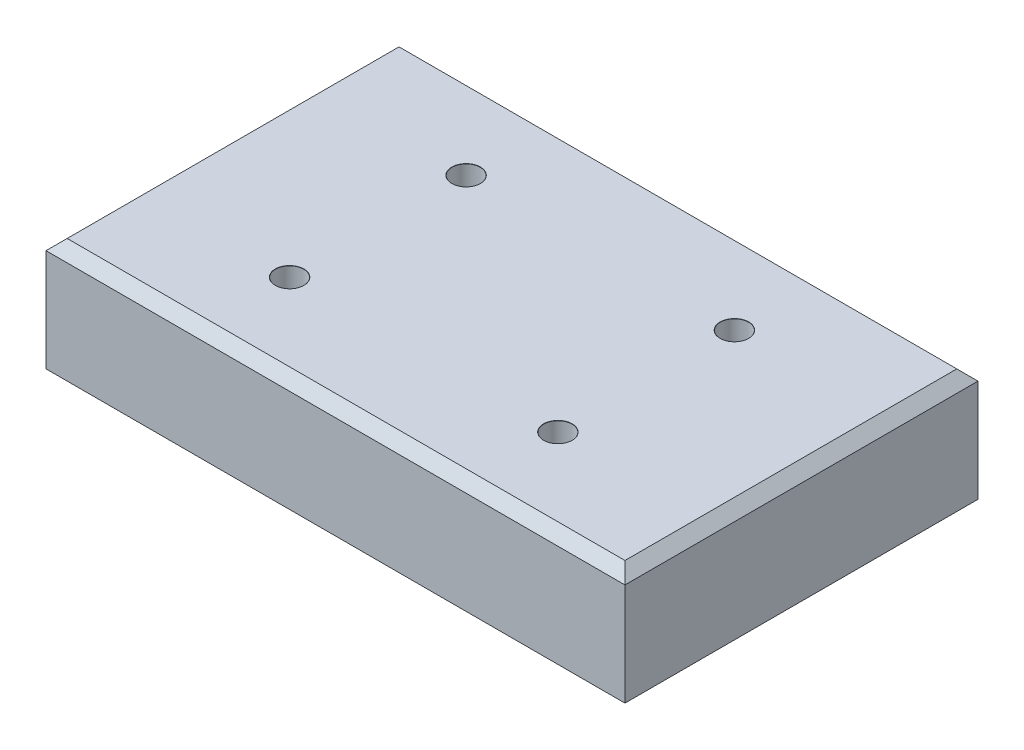
ISO-10303-21;
HEADER;
FILE_DESCRIPTION(('STEP AP214'),'2;1');
FILE_NAME('part.step','',(''),(''),'','','');
FILE_SCHEMA(('AUTOMOTIVE_DESIGN { 1 0 10303 214 1 1 1 1 }'));
ENDSEC;
DATA;
#1=APPLICATION_CONTEXT('core data for automotive mechanical design processes');
#2=APPLICATION_PROTOCOL_DEFINITION('international standard','automotive_design',2000,#1);
#3=PRODUCT_CONTEXT('',#1,'mechanical');
#4=PRODUCT('Part','Part','',(#3));
#5=PRODUCT_RELATED_PRODUCT_CATEGORY('part','',(#4));
#6=PRODUCT_DEFINITION_FORMATION('','',#4);
#7=PRODUCT_DEFINITION_CONTEXT('part definition',#1,'design');
#8=PRODUCT_DEFINITION('design','',#6,#7);
#9=PRODUCT_DEFINITION_SHAPE('','',#8);
#10=(LENGTH_UNIT() NAMED_UNIT(*) SI_UNIT(.MILLI.,.METRE.));
#11=(NAMED_UNIT(*) PLANE_ANGLE_UNIT() SI_UNIT($,.RADIAN.));
#12=(NAMED_UNIT(*) SI_UNIT($,.STERADIAN.) SOLID_ANGLE_UNIT());
#13=UNCERTAINTY_MEASURE_WITH_UNIT(LENGTH_MEASURE(1.E-05),#10,'distance_accuracy_value','');
#14=(GEOMETRIC_REPRESENTATION_CONTEXT(3) GLOBAL_UNCERTAINTY_ASSIGNED_CONTEXT((#13)) GLOBAL_UNIT_ASSIGNED_CONTEXT((#10,
#11,#12)) REPRESENTATION_CONTEXT('',''));
#15=CARTESIAN_POINT('',(0.,0.,0.));
#16=DIRECTION('',(0.,0.,1.));
#17=DIRECTION('',(1.,0.,0.));
#18=AXIS2_PLACEMENT_3D('',#15,#16,#17);
#19=CARTESIAN_POINT('',(-41.,16.,0.));
#20=DIRECTION('',(-1.,0.,0.));
#21=DIRECTION('',(0.,0.,1.));
#22=AXIS2_PLACEMENT_3D('',#19,#20,#21);
#23=PLANE('',#22);
#24=DIRECTION('',(0.,-1.,0.));
#25=VECTOR('',#24,1.);
#26=CARTESIAN_POINT('',(-41.,16.,25.));
#27=LINE('',#26,#25);
#28=CARTESIAN_POINT('',(-41.,14.5,25.));
#29=VERTEX_POINT('',#28);
#30=CARTESIAN_POINT('',(-41.,0.,25.));
#31=VERTEX_POINT('',#30);
#32=EDGE_CURVE('E217',#29,#31,#27,.T.);
#33=ORIENTED_EDGE('',*,*,#32,.F.);
#34=DIRECTION('',(0.,0.,-1.));
#35=VECTOR('',#34,1.);
#36=CARTESIAN_POINT('',(-41.,14.5,0.));
#37=LINE('',#36,#35);
#38=CARTESIAN_POINT('',(-41.,14.5,-25.));
#39=VERTEX_POINT('',#38);
#40=EDGE_CURVE('E249',#29,#39,#37,.T.);
#41=ORIENTED_EDGE('',*,*,#40,.T.);
#42=DIRECTION('',(0.,-1.,0.));
#43=VECTOR('',#42,1.);
#44=CARTESIAN_POINT('',(-41.,16.,-25.));
#45=LINE('',#44,#43);
#46=CARTESIAN_POINT('',(-41.,0.,-25.));
#47=VERTEX_POINT('',#46);
#48=EDGE_CURVE('E208',#39,#47,#45,.T.);
#49=ORIENTED_EDGE('',*,*,#48,.T.);
#50=DIRECTION('',(0.,0.,-1.));
#51=VECTOR('',#50,1.);
#52=CARTESIAN_POINT('',(-41.,0.,0.));
#53=LINE('',#52,#51);
#54=EDGE_CURVE('E192',#31,#47,#53,.T.);
#55=ORIENTED_EDGE('',*,*,#54,.F.);
#56=EDGE_LOOP('',(#33,#41,#49,#55));
#57=FACE_BOUND('',#56,.T.);
#58=ADVANCED_FACE('F50',(#57),#23,.T.);
#59=CARTESIAN_POINT('',(0.,16.,25.));
#60=DIRECTION('',(0.,0.,1.));
#61=DIRECTION('',(1.,0.,0.));
#62=AXIS2_PLACEMENT_3D('',#59,#60,#61);
#63=PLANE('',#62);
#64=DIRECTION('',(0.,-1.,0.));
#65=VECTOR('',#64,1.);
#66=CARTESIAN_POINT('',(41.,16.,25.));
#67=LINE('',#66,#65);
#68=CARTESIAN_POINT('',(41.,14.5,25.));
#69=VERTEX_POINT('',#68);
#70=CARTESIAN_POINT('',(41.,0.,25.));
#71=VERTEX_POINT('',#70);
#72=EDGE_CURVE('E214',#69,#71,#67,.T.);
#73=ORIENTED_EDGE('',*,*,#72,.F.);
#74=DIRECTION('',(-1.,0.,0.));
#75=VECTOR('',#74,1.);
#76=CARTESIAN_POINT('',(0.,14.5,25.));
#77=LINE('',#76,#75);
#78=EDGE_CURVE('E61',#69,#29,#77,.T.);
#79=ORIENTED_EDGE('',*,*,#78,.T.);
#80=ORIENTED_EDGE('',*,*,#32,.T.);
#81=DIRECTION('',(-1.,0.,0.));
#82=VECTOR('',#81,1.);
#83=CARTESIAN_POINT('',(0.,0.,25.));
#84=LINE('',#83,#82);
#85=EDGE_CURVE('E196',#71,#31,#84,.T.);
#86=ORIENTED_EDGE('',*,*,#85,.F.);
#87=EDGE_LOOP('',(#73,#79,#80,#86));
#88=FACE_BOUND('',#87,.T.);
#89=ADVANCED_FACE('F323',(#88),#63,.T.);
#90=CARTESIAN_POINT('',(41.,16.,0.));
#91=DIRECTION('',(-1.,0.,0.));
#92=DIRECTION('',(0.,0.,1.));
#93=AXIS2_PLACEMENT_3D('',#90,#91,#92);
#94=PLANE('',#93);
#95=DIRECTION('',(0.,-1.,0.));
#96=VECTOR('',#95,1.);
#97=CARTESIAN_POINT('',(41.,16.,-25.));
#98=LINE('',#97,#96);
#99=CARTESIAN_POINT('',(41.,14.5,-25.));
#100=VERTEX_POINT('',#99);
#101=CARTESIAN_POINT('',(41.,0.,-25.));
#102=VERTEX_POINT('',#101);
#103=EDGE_CURVE('E211',#100,#102,#98,.T.);
#104=ORIENTED_EDGE('',*,*,#103,.F.);
#105=DIRECTION('',(0.,0.,1.));
#106=VECTOR('',#105,1.);
#107=CARTESIAN_POINT('',(41.,14.5,25.));
#108=LINE('',#107,#106);
#109=EDGE_CURVE('E11',#100,#69,#108,.T.);
#110=ORIENTED_EDGE('',*,*,#109,.T.);
#111=ORIENTED_EDGE('',*,*,#72,.T.);
#112=DIRECTION('',(0.,0.,-1.));
#113=VECTOR('',#112,1.);
#114=CARTESIAN_POINT('',(41.,0.,0.));
#115=LINE('',#114,#113);
#116=EDGE_CURVE('E200',#71,#102,#115,.T.);
#117=ORIENTED_EDGE('',*,*,#116,.T.);
#118=EDGE_LOOP('',(#104,#110,#111,#117));
#119=FACE_BOUND('',#118,.T.);
#120=ADVANCED_FACE('F329',(#119),#94,.F.);
#121=CARTESIAN_POINT('',(0.,16.,-25.));
#122=DIRECTION('',(0.,0.,1.));
#123=DIRECTION('',(1.,0.,0.));
#124=AXIS2_PLACEMENT_3D('',#121,#122,#123);
#125=PLANE('',#124);
#126=ORIENTED_EDGE('',*,*,#48,.F.);
#127=DIRECTION('',(1.,0.,0.));
#128=VECTOR('',#127,1.);
#129=CARTESIAN_POINT('',(41.,14.5,-25.));
#130=LINE('',#129,#128);
#131=EDGE_CURVE('E245',#39,#100,#130,.T.);
#132=ORIENTED_EDGE('',*,*,#131,.T.);
#133=ORIENTED_EDGE('',*,*,#103,.T.);
#134=DIRECTION('',(-1.,0.,0.));
#135=VECTOR('',#134,1.);
#136=CARTESIAN_POINT('',(0.,0.,-25.));
#137=LINE('',#136,#135);
#138=EDGE_CURVE('E204',#102,#47,#137,.T.);
#139=ORIENTED_EDGE('',*,*,#138,.T.);
#140=EDGE_LOOP('',(#126,#132,#133,#139));
#141=FACE_BOUND('',#140,.T.);
#142=ADVANCED_FACE('F282',(#141),#125,.F.);
#143=CARTESIAN_POINT('',(0.,16.,0.));
#144=DIRECTION('',(0.,1.,0.));
#145=DIRECTION('',(0.,0.,1.));
#146=AXIS2_PLACEMENT_3D('',#143,#144,#145);
#147=PLANE('',#146);
#148=DIRECTION('',(0.,0.,-1.));
#149=VECTOR('',#148,1.);
#150=CARTESIAN_POINT('',(39.5,16.,-25.));
#151=LINE('',#150,#149);
#152=CARTESIAN_POINT('',(39.5,16.,23.5));
#153=VERTEX_POINT('',#152);
#154=CARTESIAN_POINT('',(39.5,16.,-23.5));
#155=VERTEX_POINT('',#154);
#156=EDGE_CURVE('E220',#153,#155,#151,.T.);
#157=ORIENTED_EDGE('',*,*,#156,.T.);
#158=DIRECTION('',(-1.,0.,0.));
#159=VECTOR('',#158,1.);
#160=CARTESIAN_POINT('',(-41.,16.,-23.5));
#161=LINE('',#160,#159);
#162=CARTESIAN_POINT('',(-39.5,16.,-23.5));
#163=VERTEX_POINT('',#162);
#164=EDGE_CURVE('E241',#155,#163,#161,.T.);
#165=ORIENTED_EDGE('',*,*,#164,.T.);
#166=DIRECTION('',(0.,0.,1.));
#167=VECTOR('',#166,1.);
#168=CARTESIAN_POINT('',(-39.5,16.,0.));
#169=LINE('',#168,#167);
#170=CARTESIAN_POINT('',(-39.5,16.,23.5));
#171=VERTEX_POINT('',#170);
#172=EDGE_CURVE('E238',#163,#171,#169,.T.);
#173=ORIENTED_EDGE('',*,*,#172,.T.);
#174=DIRECTION('',(1.,0.,0.));
#175=VECTOR('',#174,1.);
#176=CARTESIAN_POINT('',(0.,16.,23.5));
#177=LINE('',#176,#175);
#178=EDGE_CURVE('E235',#171,#153,#177,.T.);
#179=ORIENTED_EDGE('',*,*,#178,.T.);
#180=EDGE_LOOP('',(#157,#165,#173,#179));
#181=FACE_BOUND('',#180,.T.);
#182=CARTESIAN_POINT('',(-19.,16.,-12.5));
#183=DIRECTION('',(0.,1.,0.));
#184=DIRECTION('',(0.,0.,1.));
#185=AXIS2_PLACEMENT_3D('',#182,#183,#184);
#186=CIRCLE('',#185,2.025);
#187=CARTESIAN_POINT('',(-19.,16.,-10.475));
#188=VERTEX_POINT('',#187);
#189=EDGE_CURVE('E127',#188,#188,#186,.T.);
#190=ORIENTED_EDGE('',*,*,#189,.F.);
#191=EDGE_LOOP('',(#190));
#192=FACE_BOUND('',#191,.T.);
#193=CARTESIAN_POINT('',(19.,16.,-12.5));
#194=DIRECTION('',(0.,1.,0.));
#195=DIRECTION('',(0.,0.,1.));
#196=AXIS2_PLACEMENT_3D('',#193,#194,#195);
#197=CIRCLE('',#196,2.025);
#198=CARTESIAN_POINT('',(19.,16.,-10.475));
#199=VERTEX_POINT('',#198);
#200=EDGE_CURVE('E140',#199,#199,#197,.T.);
#201=ORIENTED_EDGE('',*,*,#200,.F.);
#202=EDGE_LOOP('',(#201));
#203=FACE_BOUND('',#202,.T.);
#204=CARTESIAN_POINT('',(19.,16.,12.5));
#205=DIRECTION('',(0.,1.,0.));
#206=DIRECTION('',(0.,0.,1.));
#207=AXIS2_PLACEMENT_3D('',#204,#205,#206);
#208=CIRCLE('',#207,2.025);
#209=CARTESIAN_POINT('',(19.,16.,14.525));
#210=VERTEX_POINT('',#209);
#211=EDGE_CURVE('E153',#210,#210,#208,.T.);
#212=ORIENTED_EDGE('',*,*,#211,.F.);
#213=EDGE_LOOP('',(#212));
#214=FACE_BOUND('',#213,.T.);
#215=CARTESIAN_POINT('',(-19.,16.,12.5));
#216=DIRECTION('',(0.,1.,0.));
#217=DIRECTION('',(0.,0.,1.));
#218=AXIS2_PLACEMENT_3D('',#215,#216,#217);
#219=CIRCLE('',#218,2.025);
#220=CARTESIAN_POINT('',(-19.,16.,14.525));
#221=VERTEX_POINT('',#220);
#222=EDGE_CURVE('E166',#221,#221,#219,.T.);
#223=ORIENTED_EDGE('',*,*,#222,.F.);
#224=EDGE_LOOP('',(#223));
#225=FACE_BOUND('',#224,.T.);
#226=ADVANCED_FACE('F288',(#181,#192,#203,#214,#225),#147,.T.);
#227=CARTESIAN_POINT('',(0.,0.,0.));
#228=DIRECTION('',(0.,1.,0.));
#229=DIRECTION('',(0.,0.,1.));
#230=AXIS2_PLACEMENT_3D('',#227,#228,#229);
#231=PLANE('',#230);
#232=ORIENTED_EDGE('',*,*,#54,.T.);
#233=ORIENTED_EDGE('',*,*,#138,.F.);
#234=ORIENTED_EDGE('',*,*,#116,.F.);
#235=ORIENTED_EDGE('',*,*,#85,.T.);
#236=EDGE_LOOP('',(#232,#233,#234,#235));
#237=FACE_BOUND('',#236,.T.);
#238=ADVANCED_FACE('F291',(#237),#231,.F.);
#239=CARTESIAN_POINT('',(-19.,16.,12.5));
#240=DIRECTION('',(0.,1.,0.));
#241=DIRECTION('',(0.,0.,1.));
#242=AXIS2_PLACEMENT_3D('',#239,#240,#241);
#243=CONICAL_SURFACE('',#242,2.025,0.785398163397448);
#244=ORIENTED_EDGE('',*,*,#222,.T.);
#245=EDGE_LOOP('',(#244));
#246=FACE_BOUND('',#245,.T.);
#247=CARTESIAN_POINT('',(-19.,15.975,12.5));
#248=DIRECTION('',(0.,1.,0.));
#249=DIRECTION('',(0.,0.,1.));
#250=AXIS2_PLACEMENT_3D('',#247,#248,#249);
#251=CIRCLE('',#250,2.);
#252=CARTESIAN_POINT('',(-19.,15.975,14.5));
#253=VERTEX_POINT('',#252);
#254=EDGE_CURVE('E180',#253,#253,#251,.T.);
#255=ORIENTED_EDGE('',*,*,#254,.F.);
#256=EDGE_LOOP('',(#255));
#257=FACE_BOUND('',#256,.T.);
#258=ADVANCED_FACE('F301',(#246,#257),#243,.F.);
#259=CARTESIAN_POINT('',(0.,10.,0.));
#260=DIRECTION('',(0.,1.,0.));
#261=DIRECTION('',(0.,0.,1.));
#262=AXIS2_PLACEMENT_3D('',#259,#260,#261);
#263=PLANE('',#262);
#264=CARTESIAN_POINT('',(-19.,10.,12.5));
#265=DIRECTION('',(0.,1.,0.));
#266=DIRECTION('',(0.,0.,1.));
#267=AXIS2_PLACEMENT_3D('',#264,#265,#266);
#268=CIRCLE('',#267,1.65);
#269=CARTESIAN_POINT('',(-19.,10.,14.15));
#270=VERTEX_POINT('',#269);
#271=EDGE_CURVE('E174',#270,#270,#268,.T.);
#272=ORIENTED_EDGE('',*,*,#271,.F.);
#273=EDGE_LOOP('',(#272));
#274=FACE_BOUND('',#273,.T.);
#275=CARTESIAN_POINT('',(-19.,10.,12.5));
#276=DIRECTION('',(0.,1.,0.));
#277=DIRECTION('',(0.,0.,1.));
#278=AXIS2_PLACEMENT_3D('',#275,#276,#277);
#279=CIRCLE('',#278,2.);
#280=CARTESIAN_POINT('',(-19.,10.,14.5));
#281=VERTEX_POINT('',#280);
#282=EDGE_CURVE('E185',#281,#281,#279,.T.);
#283=ORIENTED_EDGE('',*,*,#282,.T.);
#284=EDGE_LOOP('',(#283));
#285=FACE_BOUND('',#284,.T.);
#286=ADVANCED_FACE('F304',(#274,#285),#263,.T.);
#287=CARTESIAN_POINT('',(-19.,10.,12.5));
#288=DIRECTION('',(0.,1.,0.));
#289=DIRECTION('',(0.,0.,1.));
#290=AXIS2_PLACEMENT_3D('',#287,#288,#289);
#291=CYLINDRICAL_SURFACE('',#290,2.);
#292=ORIENTED_EDGE('',*,*,#254,.T.);
#293=EDGE_LOOP('',(#292));
#294=FACE_BOUND('',#293,.T.);
#295=ORIENTED_EDGE('',*,*,#282,.F.);
#296=EDGE_LOOP('',(#295));
#297=FACE_BOUND('',#296,.T.);
#298=ADVANCED_FACE('F308',(#294,#297),#291,.F.);
#299=CARTESIAN_POINT('',(-19.,8.99142002139547,12.5));
#300=DIRECTION('',(0.,1.,0.));
#301=DIRECTION('',(0.,0.,1.));
#302=AXIS2_PLACEMENT_3D('',#299,#300,#301);
#303=CONICAL_SURFACE('',#302,1.65,1.02974425867665);
#304=CARTESIAN_POINT('',(-19.,8.,12.5));
#305=VERTEX_POINT('',#304);
#306=VERTEX_LOOP('',#305);
#307=FACE_BOUND('',#306,.T.);
#308=CARTESIAN_POINT('',(-19.,8.99142002139547,12.5));
#309=DIRECTION('',(0.,1.,0.));
#310=DIRECTION('',(0.,0.,1.));
#311=AXIS2_PLACEMENT_3D('',#308,#309,#310);
#312=CIRCLE('',#311,1.65);
#313=CARTESIAN_POINT('',(-19.,8.99142002139547,14.15));
#314=VERTEX_POINT('',#313);
#315=EDGE_CURVE('E170',#314,#314,#312,.T.);
#316=ORIENTED_EDGE('',*,*,#315,.T.);
#317=EDGE_LOOP('',(#316));
#318=FACE_BOUND('',#317,.T.);
#319=ADVANCED_FACE('F311',(#307,#318),#303,.F.);
#320=CARTESIAN_POINT('',(-19.,16.,12.5));
#321=DIRECTION('',(0.,1.,0.));
#322=DIRECTION('',(0.,0.,1.));
#323=AXIS2_PLACEMENT_3D('',#320,#321,#322);
#324=CYLINDRICAL_SURFACE('',#323,1.65);
#325=ORIENTED_EDGE('',*,*,#271,.T.);
#326=EDGE_LOOP('',(#325));
#327=FACE_BOUND('',#326,.T.);
#328=ORIENTED_EDGE('',*,*,#315,.F.);
#329=EDGE_LOOP('',(#328));
#330=FACE_BOUND('',#329,.T.);
#331=ADVANCED_FACE('F378',(#327,#330),#324,.F.);
#332=CARTESIAN_POINT('',(19.,16.,12.5));
#333=DIRECTION('',(0.,1.,0.));
#334=DIRECTION('',(0.,0.,1.));
#335=AXIS2_PLACEMENT_3D('',#332,#333,#334);
#336=CONICAL_SURFACE('',#335,2.025,0.785398163397448);
#337=ORIENTED_EDGE('',*,*,#211,.T.);
#338=EDGE_LOOP('',(#337));
#339=FACE_BOUND('',#338,.T.);
#340=CARTESIAN_POINT('',(19.,15.975,12.5));
#341=DIRECTION('',(0.,1.,0.));
#342=DIRECTION('',(0.,0.,1.));
#343=AXIS2_PLACEMENT_3D('',#340,#341,#342);
#344=CIRCLE('',#343,2.);
#345=CARTESIAN_POINT('',(19.,15.975,14.5));
#346=VERTEX_POINT('',#345);
#347=EDGE_CURVE('E162',#346,#346,#344,.T.);
#348=ORIENTED_EDGE('',*,*,#347,.F.);
#349=EDGE_LOOP('',(#348));
#350=FACE_BOUND('',#349,.T.);
#351=ADVANCED_FACE('F374',(#339,#350),#336,.F.);
#352=CARTESIAN_POINT('',(0.,10.,0.));
#353=DIRECTION('',(0.,1.,0.));
#354=DIRECTION('',(0.,0.,1.));
#355=AXIS2_PLACEMENT_3D('',#352,#353,#354);
#356=PLANE('',#355);
#357=CARTESIAN_POINT('',(19.,10.,12.5));
#358=DIRECTION('',(0.,1.,0.));
#359=DIRECTION('',(0.,0.,1.));
#360=AXIS2_PLACEMENT_3D('',#357,#358,#359);
#361=CIRCLE('',#360,1.65);
#362=CARTESIAN_POINT('',(19.,10.,14.15));
#363=VERTEX_POINT('',#362);
#364=EDGE_CURVE('E161',#363,#363,#361,.T.);
#365=ORIENTED_EDGE('',*,*,#364,.F.);
#366=EDGE_LOOP('',(#365));
#367=FACE_BOUND('',#366,.T.);
#368=CARTESIAN_POINT('',(19.,10.,12.5));
#369=DIRECTION('',(0.,1.,0.));
#370=DIRECTION('',(0.,0.,1.));
#371=AXIS2_PLACEMENT_3D('',#368,#369,#370);
#372=CIRCLE('',#371,2.);
#373=CARTESIAN_POINT('',(19.,10.,14.5));
#374=VERTEX_POINT('',#373);
#375=EDGE_CURVE('E179',#374,#374,#372,.T.);
#376=ORIENTED_EDGE('',*,*,#375,.T.);
#377=EDGE_LOOP('',(#376));
#378=FACE_BOUND('',#377,.T.);
#379=ADVANCED_FACE('F377',(#367,#378),#356,.T.);
#380=CARTESIAN_POINT('',(19.,10.,12.5));
#381=DIRECTION('',(0.,1.,0.));
#382=DIRECTION('',(0.,0.,1.));
#383=AXIS2_PLACEMENT_3D('',#380,#381,#382);
#384=CYLINDRICAL_SURFACE('',#383,2.);
#385=ORIENTED_EDGE('',*,*,#347,.T.);
#386=EDGE_LOOP('',(#385));
#387=FACE_BOUND('',#386,.T.);
#388=ORIENTED_EDGE('',*,*,#375,.F.);
#389=EDGE_LOOP('',(#388));
#390=FACE_BOUND('',#389,.T.);
#391=ADVANCED_FACE('F385',(#387,#390),#384,.F.);
#392=CARTESIAN_POINT('',(19.,8.99142002139547,12.5));
#393=DIRECTION('',(0.,1.,0.));
#394=DIRECTION('',(0.,0.,1.));
#395=AXIS2_PLACEMENT_3D('',#392,#393,#394);
#396=CONICAL_SURFACE('',#395,1.65,1.02974425867665);
#397=CARTESIAN_POINT('',(19.,8.,12.5));
#398=VERTEX_POINT('',#397);
#399=VERTEX_LOOP('',#398);
#400=FACE_BOUND('',#399,.T.);
#401=CARTESIAN_POINT('',(19.,8.99142002139547,12.5));
#402=DIRECTION('',(0.,1.,0.));
#403=DIRECTION('',(0.,0.,1.));
#404=AXIS2_PLACEMENT_3D('',#401,#402,#403);
#405=CIRCLE('',#404,1.65);
#406=CARTESIAN_POINT('',(19.,8.99142002139547,14.15));
#407=VERTEX_POINT('',#406);
#408=EDGE_CURVE('E157',#407,#407,#405,.T.);
#409=ORIENTED_EDGE('',*,*,#408,.T.);
#410=EDGE_LOOP('',(#409));
#411=FACE_BOUND('',#410,.T.);
#412=ADVANCED_FACE('F382',(#400,#411),#396,.F.);
#413=CARTESIAN_POINT('',(19.,16.,12.5));
#414=DIRECTION('',(0.,1.,0.));
#415=DIRECTION('',(0.,0.,1.));
#416=AXIS2_PLACEMENT_3D('',#413,#414,#415);
#417=CYLINDRICAL_SURFACE('',#416,1.65);
#418=ORIENTED_EDGE('',*,*,#364,.T.);
#419=EDGE_LOOP('',(#418));
#420=FACE_BOUND('',#419,.T.);
#421=ORIENTED_EDGE('',*,*,#408,.F.);
#422=EDGE_LOOP('',(#421));
#423=FACE_BOUND('',#422,.T.);
#424=ADVANCED_FACE('F363',(#420,#423),#417,.F.);
#425=CARTESIAN_POINT('',(19.,16.,-12.5));
#426=DIRECTION('',(0.,1.,0.));
#427=DIRECTION('',(0.,0.,1.));
#428=AXIS2_PLACEMENT_3D('',#425,#426,#427);
#429=CONICAL_SURFACE('',#428,2.025,0.785398163397448);
#430=ORIENTED_EDGE('',*,*,#200,.T.);
#431=EDGE_LOOP('',(#430));
#432=FACE_BOUND('',#431,.T.);
#433=CARTESIAN_POINT('',(19.,15.975,-12.5));
#434=DIRECTION('',(0.,1.,0.));
#435=DIRECTION('',(0.,0.,1.));
#436=AXIS2_PLACEMENT_3D('',#433,#434,#435);
#437=CIRCLE('',#436,2.);
#438=CARTESIAN_POINT('',(19.,15.975,-10.5));
#439=VERTEX_POINT('',#438);
#440=EDGE_CURVE('E149',#439,#439,#437,.T.);
#441=ORIENTED_EDGE('',*,*,#440,.F.);
#442=EDGE_LOOP('',(#441));
#443=FACE_BOUND('',#442,.T.);
#444=ADVANCED_FACE('F359',(#432,#443),#429,.F.);
#445=CARTESIAN_POINT('',(0.,10.,0.));
#446=DIRECTION('',(0.,1.,0.));
#447=DIRECTION('',(0.,0.,1.));
#448=AXIS2_PLACEMENT_3D('',#445,#446,#447);
#449=PLANE('',#448);
#450=CARTESIAN_POINT('',(19.,10.,-12.5));
#451=DIRECTION('',(0.,1.,0.));
#452=DIRECTION('',(0.,0.,1.));
#453=AXIS2_PLACEMENT_3D('',#450,#451,#452);
#454=CIRCLE('',#453,1.65);
#455=CARTESIAN_POINT('',(19.,10.,-10.85));
#456=VERTEX_POINT('',#455);
#457=EDGE_CURVE('E148',#456,#456,#454,.T.);
#458=ORIENTED_EDGE('',*,*,#457,.F.);
#459=EDGE_LOOP('',(#458));
#460=FACE_BOUND('',#459,.T.);
#461=CARTESIAN_POINT('',(19.,10.,-12.5));
#462=DIRECTION('',(0.,1.,0.));
#463=DIRECTION('',(0.,0.,1.));
#464=AXIS2_PLACEMENT_3D('',#461,#462,#463);
#465=CIRCLE('',#464,2.);
#466=CARTESIAN_POINT('',(19.,10.,-10.5));
#467=VERTEX_POINT('',#466);
#468=EDGE_CURVE('E175',#467,#467,#465,.T.);
#469=ORIENTED_EDGE('',*,*,#468,.T.);
#470=EDGE_LOOP('',(#469));
#471=FACE_BOUND('',#470,.T.);
#472=ADVANCED_FACE('F362',(#460,#471),#449,.T.);
#473=CARTESIAN_POINT('',(19.,10.,-12.5));
#474=DIRECTION('',(0.,1.,0.));
#475=DIRECTION('',(0.,0.,1.));
#476=AXIS2_PLACEMENT_3D('',#473,#474,#475);
#477=CYLINDRICAL_SURFACE('',#476,2.);
#478=ORIENTED_EDGE('',*,*,#440,.T.);
#479=EDGE_LOOP('',(#478));
#480=FACE_BOUND('',#479,.T.);
#481=ORIENTED_EDGE('',*,*,#468,.F.);
#482=EDGE_LOOP('',(#481));
#483=FACE_BOUND('',#482,.T.);
#484=ADVANCED_FACE('F372',(#480,#483),#477,.F.);
#485=CARTESIAN_POINT('',(19.,8.99142002139547,-12.5));
#486=DIRECTION('',(0.,1.,0.));
#487=DIRECTION('',(0.,0.,1.));
#488=AXIS2_PLACEMENT_3D('',#485,#486,#487);
#489=CONICAL_SURFACE('',#488,1.65,1.02974425867665);
#490=CARTESIAN_POINT('',(19.,8.,-12.5));
#491=VERTEX_POINT('',#490);
#492=VERTEX_LOOP('',#491);
#493=FACE_BOUND('',#492,.T.);
#494=CARTESIAN_POINT('',(19.,8.99142002139547,-12.5));
#495=DIRECTION('',(0.,1.,0.));
#496=DIRECTION('',(0.,0.,1.));
#497=AXIS2_PLACEMENT_3D('',#494,#495,#496);
#498=CIRCLE('',#497,1.65);
#499=CARTESIAN_POINT('',(19.,8.99142002139547,-10.85));
#500=VERTEX_POINT('',#499);
#501=EDGE_CURVE('E144',#500,#500,#498,.T.);
#502=ORIENTED_EDGE('',*,*,#501,.T.);
#503=EDGE_LOOP('',(#502));
#504=FACE_BOUND('',#503,.T.);
#505=ADVANCED_FACE('F368',(#493,#504),#489,.F.);
#506=CARTESIAN_POINT('',(19.,16.,-12.5));
#507=DIRECTION('',(0.,1.,0.));
#508=DIRECTION('',(0.,0.,1.));
#509=AXIS2_PLACEMENT_3D('',#506,#507,#508);
#510=CYLINDRICAL_SURFACE('',#509,1.65);
#511=ORIENTED_EDGE('',*,*,#457,.T.);
#512=EDGE_LOOP('',(#511));
#513=FACE_BOUND('',#512,.T.);
#514=ORIENTED_EDGE('',*,*,#501,.F.);
#515=EDGE_LOOP('',(#514));
#516=FACE_BOUND('',#515,.T.);
#517=ADVANCED_FACE('F365',(#513,#516),#510,.F.);
#518=CARTESIAN_POINT('',(-19.,16.,-12.5));
#519=DIRECTION('',(0.,1.,0.));
#520=DIRECTION('',(0.,0.,1.));
#521=AXIS2_PLACEMENT_3D('',#518,#519,#520);
#522=CONICAL_SURFACE('',#521,2.025,0.785398163397448);
#523=ORIENTED_EDGE('',*,*,#189,.T.);
#524=EDGE_LOOP('',(#523));
#525=FACE_BOUND('',#524,.T.);
#526=CARTESIAN_POINT('',(-19.,15.975,-12.5));
#527=DIRECTION('',(0.,1.,0.));
#528=DIRECTION('',(0.,0.,1.));
#529=AXIS2_PLACEMENT_3D('',#526,#527,#528);
#530=CIRCLE('',#529,2.);
#531=CARTESIAN_POINT('',(-19.,15.975,-10.5));
#532=VERTEX_POINT('',#531);
#533=EDGE_CURVE('E132',#532,#532,#530,.T.);
#534=ORIENTED_EDGE('',*,*,#533,.F.);
#535=EDGE_LOOP('',(#534));
#536=FACE_BOUND('',#535,.T.);
#537=ADVANCED_FACE('F357',(#525,#536),#522,.F.);
#538=CARTESIAN_POINT('',(0.,10.,0.));
#539=DIRECTION('',(0.,1.,0.));
#540=DIRECTION('',(0.,0.,1.));
#541=AXIS2_PLACEMENT_3D('',#538,#539,#540);
#542=PLANE('',#541);
#543=CARTESIAN_POINT('',(-19.,10.,-12.5));
#544=DIRECTION('',(0.,1.,0.));
#545=DIRECTION('',(0.,0.,1.));
#546=AXIS2_PLACEMENT_3D('',#543,#544,#545);
#547=CIRCLE('',#546,1.65);
#548=CARTESIAN_POINT('',(-19.,10.,-10.85));
#549=VERTEX_POINT('',#548);
#550=EDGE_CURVE('E126',#549,#549,#547,.T.);
#551=ORIENTED_EDGE('',*,*,#550,.F.);
#552=EDGE_LOOP('',(#551));
#553=FACE_BOUND('',#552,.T.);
#554=CARTESIAN_POINT('',(-19.,10.,-12.5));
#555=DIRECTION('',(0.,1.,0.));
#556=DIRECTION('',(0.,0.,1.));
#557=AXIS2_PLACEMENT_3D('',#554,#555,#556);
#558=CIRCLE('',#557,2.);
#559=CARTESIAN_POINT('',(-19.,10.,-10.5));
#560=VERTEX_POINT('',#559);
#561=EDGE_CURVE('E181',#560,#560,#558,.T.);
#562=ORIENTED_EDGE('',*,*,#561,.T.);
#563=EDGE_LOOP('',(#562));
#564=FACE_BOUND('',#563,.T.);
#565=ADVANCED_FACE('F400',(#553,#564),#542,.T.);
#566=CARTESIAN_POINT('',(-19.,10.,-12.5));
#567=DIRECTION('',(0.,1.,0.));
#568=DIRECTION('',(0.,0.,1.));
#569=AXIS2_PLACEMENT_3D('',#566,#567,#568);
#570=CYLINDRICAL_SURFACE('',#569,2.);
#571=ORIENTED_EDGE('',*,*,#533,.T.);
#572=EDGE_LOOP('',(#571));
#573=FACE_BOUND('',#572,.T.);
#574=ORIENTED_EDGE('',*,*,#561,.F.);
#575=EDGE_LOOP('',(#574));
#576=FACE_BOUND('',#575,.T.);
#577=ADVANCED_FACE('F119',(#573,#576),#570,.F.);
#578=CARTESIAN_POINT('',(-19.,8.99142002139547,-12.5));
#579=DIRECTION('',(0.,1.,0.));
#580=DIRECTION('',(0.,0.,1.));
#581=AXIS2_PLACEMENT_3D('',#578,#579,#580);
#582=CONICAL_SURFACE('',#581,1.65,1.02974425867665);
#583=CARTESIAN_POINT('',(-19.,8.,-12.5));
#584=VERTEX_POINT('',#583);
#585=VERTEX_LOOP('',#584);
#586=FACE_BOUND('',#585,.T.);
#587=CARTESIAN_POINT('',(-19.,8.99142002139547,-12.5));
#588=DIRECTION('',(0.,1.,0.));
#589=DIRECTION('',(0.,0.,1.));
#590=AXIS2_PLACEMENT_3D('',#587,#588,#589);
#591=CIRCLE('',#590,1.65);
#592=CARTESIAN_POINT('',(-19.,8.99142002139547,-10.85));
#593=VERTEX_POINT('',#592);
#594=EDGE_CURVE('E123',#593,#593,#591,.T.);
#595=ORIENTED_EDGE('',*,*,#594,.T.);
#596=EDGE_LOOP('',(#595));
#597=FACE_BOUND('',#596,.T.);
#598=ADVANCED_FACE('F115',(#586,#597),#582,.F.);
#599=CARTESIAN_POINT('',(-19.,16.,-12.5));
#600=DIRECTION('',(0.,1.,0.));
#601=DIRECTION('',(0.,0.,1.));
#602=AXIS2_PLACEMENT_3D('',#599,#600,#601);
#603=CYLINDRICAL_SURFACE('',#602,1.65);
#604=ORIENTED_EDGE('',*,*,#550,.T.);
#605=EDGE_LOOP('',(#604));
#606=FACE_BOUND('',#605,.T.);
#607=ORIENTED_EDGE('',*,*,#594,.F.);
#608=EDGE_LOOP('',(#607));
#609=FACE_BOUND('',#608,.T.);
#610=ADVANCED_FACE('F118',(#606,#609),#603,.F.);
#611=CARTESIAN_POINT('',(0.,14.5,25.));
#612=DIRECTION('',(0.,-0.707106781186544,-0.707106781186551));
#613=DIRECTION('',(-1.,0.,0.));
#614=AXIS2_PLACEMENT_3D('',#611,#612,#613);
#615=PLANE('',#614);
#616=DIRECTION('',(-0.577350269189624,-0.577350269189629,0.577350269189624));
#617=VECTOR('',#616,1.);
#618=CARTESIAN_POINT('',(-27.3333333333334,28.1666666666667,11.3333333333334));
#619=LINE('',#618,#617);
#620=EDGE_CURVE('E259',#29,#171,#619,.F.);
#621=ORIENTED_EDGE('',*,*,#620,.F.);
#622=ORIENTED_EDGE('',*,*,#78,.F.);
#623=DIRECTION('',(-0.577350269189624,0.577350269189629,-0.577350269189624));
#624=VECTOR('',#623,1.);
#625=CARTESIAN_POINT('',(31.6666666666667,23.8333333333334,15.6666666666667));
#626=LINE('',#625,#624);
#627=EDGE_CURVE('E55',#153,#69,#626,.F.);
#628=ORIENTED_EDGE('',*,*,#627,.F.);
#629=ORIENTED_EDGE('',*,*,#178,.F.);
#630=EDGE_LOOP('',(#621,#622,#628,#629));
#631=FACE_BOUND('',#630,.T.);
#632=ADVANCED_FACE('F53',(#631),#615,.F.);
#633=CARTESIAN_POINT('',(39.5,16.,0.));
#634=DIRECTION('',(0.707106781186551,0.707106781186544,0.));
#635=DIRECTION('',(0.,0.,1.));
#636=AXIS2_PLACEMENT_3D('',#633,#634,#635);
#637=PLANE('',#636);
#638=ORIENTED_EDGE('',*,*,#627,.T.);
#639=ORIENTED_EDGE('',*,*,#109,.F.);
#640=DIRECTION('',(-0.577350269189624,0.577350269189629,0.577350269189624));
#641=VECTOR('',#640,1.);
#642=CARTESIAN_POINT('',(31.6666666666667,23.8333333333334,-15.6666666666667));
#643=LINE('',#642,#641);
#644=EDGE_CURVE('E257',#155,#100,#643,.F.);
#645=ORIENTED_EDGE('',*,*,#644,.F.);
#646=ORIENTED_EDGE('',*,*,#156,.F.);
#647=EDGE_LOOP('',(#638,#639,#645,#646));
#648=FACE_BOUND('',#647,.T.);
#649=ADVANCED_FACE('F271',(#648),#637,.T.);
#650=CARTESIAN_POINT('',(-41.,14.5,0.));
#651=DIRECTION('',(0.707106781186551,-0.707106781186544,0.));
#652=DIRECTION('',(0.,0.,-1.));
#653=AXIS2_PLACEMENT_3D('',#650,#651,#652);
#654=PLANE('',#653);
#655=ORIENTED_EDGE('',*,*,#620,.T.);
#656=ORIENTED_EDGE('',*,*,#172,.F.);
#657=DIRECTION('',(0.577350269189624,0.577350269189629,0.577350269189624));
#658=VECTOR('',#657,1.);
#659=CARTESIAN_POINT('',(-32.6666666666667,22.8333333333333,-16.6666666666667));
#660=LINE('',#659,#658);
#661=EDGE_CURVE('E254',#39,#163,#660,.T.);
#662=ORIENTED_EDGE('',*,*,#661,.F.);
#663=ORIENTED_EDGE('',*,*,#40,.F.);
#664=EDGE_LOOP('',(#655,#656,#662,#663));
#665=FACE_BOUND('',#664,.T.);
#666=ADVANCED_FACE('F276',(#665),#654,.F.);
#667=CARTESIAN_POINT('',(0.,16.,-23.5));
#668=DIRECTION('',(0.,0.707106781186544,-0.707106781186551));
#669=DIRECTION('',(1.,0.,0.));
#670=AXIS2_PLACEMENT_3D('',#667,#668,#669);
#671=PLANE('',#670);
#672=ORIENTED_EDGE('',*,*,#644,.T.);
#673=ORIENTED_EDGE('',*,*,#131,.F.);
#674=ORIENTED_EDGE('',*,*,#661,.T.);
#675=ORIENTED_EDGE('',*,*,#164,.F.);
#676=EDGE_LOOP('',(#672,#673,#674,#675));
#677=FACE_BOUND('',#676,.T.);
#678=ADVANCED_FACE('F285',(#677),#671,.T.);
#679=CLOSED_SHELL('',(#58,#89,#120,#142,#226,#238,#258,#286,#298,#319,#331,#351,#379,#391,#412,
#424,#444,#472,#484,#505,#517,#537,#565,#577,#598,#610,#632,#649,#666,#678));
#680=MANIFOLD_SOLID_BREP('B2',#679);
#681=ADVANCED_BREP_SHAPE_REPRESENTATION('',(#18,#680),#14);
#682=SHAPE_DEFINITION_REPRESENTATION(#9,#681);
ENDSEC;
END-ISO-10303-21;
